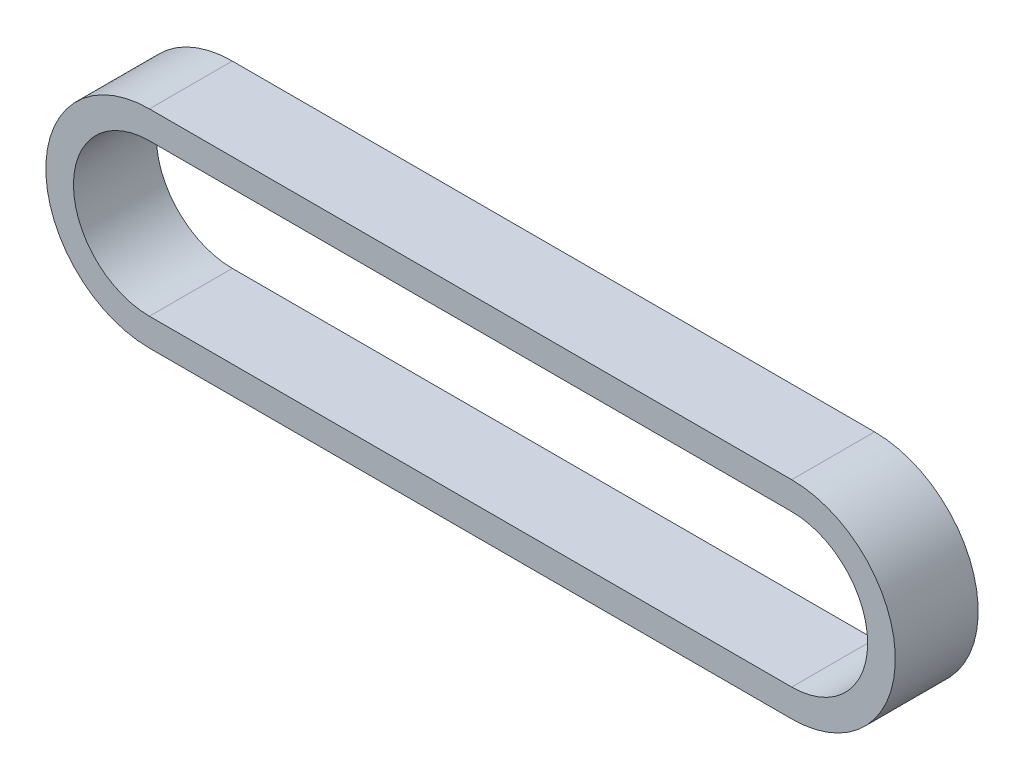
ISO-10303-21;
HEADER;
FILE_DESCRIPTION(('STEP AP214'),'2;1');
FILE_NAME('part.step','',(''),(''),'','','');
FILE_SCHEMA(('AUTOMOTIVE_DESIGN { 1 0 10303 214 1 1 1 1 }'));
ENDSEC;
DATA;
#1=APPLICATION_CONTEXT('core data for automotive mechanical design processes');
#2=APPLICATION_PROTOCOL_DEFINITION('international standard','automotive_design',2000,#1);
#3=PRODUCT_CONTEXT('',#1,'mechanical');
#4=PRODUCT('Part','Part','',(#3));
#5=PRODUCT_RELATED_PRODUCT_CATEGORY('part','',(#4));
#6=PRODUCT_DEFINITION_FORMATION('','',#4);
#7=PRODUCT_DEFINITION_CONTEXT('part definition',#1,'design');
#8=PRODUCT_DEFINITION('design','',#6,#7);
#9=PRODUCT_DEFINITION_SHAPE('','',#8);
#10=(LENGTH_UNIT() NAMED_UNIT(*) SI_UNIT(.MILLI.,.METRE.));
#11=(NAMED_UNIT(*) PLANE_ANGLE_UNIT() SI_UNIT($,.RADIAN.));
#12=(NAMED_UNIT(*) SI_UNIT($,.STERADIAN.) SOLID_ANGLE_UNIT());
#13=UNCERTAINTY_MEASURE_WITH_UNIT(LENGTH_MEASURE(1.E-05),#10,'distance_accuracy_value','');
#14=(GEOMETRIC_REPRESENTATION_CONTEXT(3) GLOBAL_UNCERTAINTY_ASSIGNED_CONTEXT((#13)) GLOBAL_UNIT_ASSIGNED_CONTEXT((#10,
#11,#12)) REPRESENTATION_CONTEXT('',''));
#15=CARTESIAN_POINT('',(0.,0.,0.));
#16=DIRECTION('',(0.,0.,1.));
#17=DIRECTION('',(1.,0.,0.));
#18=AXIS2_PLACEMENT_3D('',#15,#16,#17);
#19=CARTESIAN_POINT('',(0.,0.,6.));
#20=DIRECTION('',(0.,0.,1.));
#21=DIRECTION('',(1.,0.,0.));
#22=AXIS2_PLACEMENT_3D('',#19,#20,#21);
#23=PLANE('',#22);
#24=CARTESIAN_POINT('',(0.,0.,6.));
#25=DIRECTION('',(0.,0.,1.));
#26=DIRECTION('',(1.,0.,0.));
#27=AXIS2_PLACEMENT_3D('',#24,#25,#26);
#28=CIRCLE('',#27,7.5);
#29=CARTESIAN_POINT('',(0.,7.5,6.));
#30=VERTEX_POINT('',#29);
#31=CARTESIAN_POINT('',(0.,-7.5,6.));
#32=VERTEX_POINT('',#31);
#33=EDGE_CURVE('E136',#30,#32,#28,.T.);
#34=ORIENTED_EDGE('',*,*,#33,.T.);
#35=DIRECTION('',(1.,0.,0.));
#36=VECTOR('',#35,1.);
#37=CARTESIAN_POINT('',(0.,-7.5,6.));
#38=LINE('',#37,#36);
#39=CARTESIAN_POINT('',(46.5,-7.5,6.));
#40=VERTEX_POINT('',#39);
#41=EDGE_CURVE('E139',#32,#40,#38,.T.);
#42=ORIENTED_EDGE('',*,*,#41,.T.);
#43=CARTESIAN_POINT('',(46.5,0.,6.));
#44=DIRECTION('',(0.,0.,1.));
#45=DIRECTION('',(1.,0.,0.));
#46=AXIS2_PLACEMENT_3D('',#43,#44,#45);
#47=CIRCLE('',#46,7.5);
#48=CARTESIAN_POINT('',(46.5,7.5,6.));
#49=VERTEX_POINT('',#48);
#50=EDGE_CURVE('E142',#40,#49,#47,.T.);
#51=ORIENTED_EDGE('',*,*,#50,.T.);
#52=DIRECTION('',(-1.,0.,0.));
#53=VECTOR('',#52,1.);
#54=CARTESIAN_POINT('',(0.,7.5,6.));
#55=LINE('',#54,#53);
#56=EDGE_CURVE('E144',#49,#30,#55,.T.);
#57=ORIENTED_EDGE('',*,*,#56,.T.);
#58=EDGE_LOOP('',(#34,#42,#51,#57));
#59=FACE_BOUND('',#58,.T.);
#60=DIRECTION('',(1.,0.,0.));
#61=VECTOR('',#60,1.);
#62=CARTESIAN_POINT('',(0.,-5.5,6.));
#63=LINE('',#62,#61);
#64=CARTESIAN_POINT('',(0.,-5.5,6.));
#65=VERTEX_POINT('',#64);
#66=CARTESIAN_POINT('',(46.5,-5.5,6.));
#67=VERTEX_POINT('',#66);
#68=EDGE_CURVE('E108',#65,#67,#63,.T.);
#69=ORIENTED_EDGE('',*,*,#68,.F.);
#70=CARTESIAN_POINT('',(0.,0.,6.));
#71=DIRECTION('',(0.,0.,1.));
#72=DIRECTION('',(1.,0.,0.));
#73=AXIS2_PLACEMENT_3D('',#70,#71,#72);
#74=CIRCLE('',#73,5.5);
#75=CARTESIAN_POINT('',(0.,5.5,6.));
#76=VERTEX_POINT('',#75);
#77=EDGE_CURVE('E100',#76,#65,#74,.T.);
#78=ORIENTED_EDGE('',*,*,#77,.F.);
#79=DIRECTION('',(-1.,0.,0.));
#80=VECTOR('',#79,1.);
#81=CARTESIAN_POINT('',(0.,5.5,6.));
#82=LINE('',#81,#80);
#83=CARTESIAN_POINT('',(46.5,5.5,6.));
#84=VERTEX_POINT('',#83);
#85=EDGE_CURVE('E122',#84,#76,#82,.T.);
#86=ORIENTED_EDGE('',*,*,#85,.F.);
#87=CARTESIAN_POINT('',(46.5,0.,6.));
#88=DIRECTION('',(0.,0.,1.));
#89=DIRECTION('',(1.,0.,0.));
#90=AXIS2_PLACEMENT_3D('',#87,#88,#89);
#91=CIRCLE('',#90,5.5);
#92=EDGE_CURVE('E120',#67,#84,#91,.T.);
#93=ORIENTED_EDGE('',*,*,#92,.F.);
#94=EDGE_LOOP('',(#69,#78,#86,#93));
#95=FACE_BOUND('',#94,.T.);
#96=ADVANCED_FACE('F35',(#59,#95),#23,.T.);
#97=CARTESIAN_POINT('',(0.,0.,0.));
#98=DIRECTION('',(0.,0.,1.));
#99=DIRECTION('',(1.,0.,0.));
#100=AXIS2_PLACEMENT_3D('',#97,#98,#99);
#101=PLANE('',#100);
#102=CARTESIAN_POINT('',(0.,0.,0.));
#103=DIRECTION('',(0.,0.,1.));
#104=DIRECTION('',(1.,0.,0.));
#105=AXIS2_PLACEMENT_3D('',#102,#103,#104);
#106=CIRCLE('',#105,7.5);
#107=CARTESIAN_POINT('',(0.,7.5,0.));
#108=VERTEX_POINT('',#107);
#109=CARTESIAN_POINT('',(0.,-7.5,0.));
#110=VERTEX_POINT('',#109);
#111=EDGE_CURVE('E116',#108,#110,#106,.T.);
#112=ORIENTED_EDGE('',*,*,#111,.F.);
#113=DIRECTION('',(-1.,0.,0.));
#114=VECTOR('',#113,1.);
#115=CARTESIAN_POINT('',(0.,7.5,0.));
#116=LINE('',#115,#114);
#117=CARTESIAN_POINT('',(46.5,7.5,0.));
#118=VERTEX_POINT('',#117);
#119=EDGE_CURVE('E140',#118,#108,#116,.T.);
#120=ORIENTED_EDGE('',*,*,#119,.F.);
#121=CARTESIAN_POINT('',(46.5,0.,0.));
#122=DIRECTION('',(0.,0.,1.));
#123=DIRECTION('',(1.,0.,0.));
#124=AXIS2_PLACEMENT_3D('',#121,#122,#123);
#125=CIRCLE('',#124,7.5);
#126=CARTESIAN_POINT('',(46.5,-7.5,0.));
#127=VERTEX_POINT('',#126);
#128=EDGE_CURVE('E151',#127,#118,#125,.T.);
#129=ORIENTED_EDGE('',*,*,#128,.F.);
#130=DIRECTION('',(1.,0.,0.));
#131=VECTOR('',#130,1.);
#132=CARTESIAN_POINT('',(0.,-7.5,0.));
#133=LINE('',#132,#131);
#134=EDGE_CURVE('E149',#110,#127,#133,.T.);
#135=ORIENTED_EDGE('',*,*,#134,.F.);
#136=EDGE_LOOP('',(#112,#120,#129,#135));
#137=FACE_BOUND('',#136,.T.);
#138=CARTESIAN_POINT('',(0.,0.,0.));
#139=DIRECTION('',(0.,0.,1.));
#140=DIRECTION('',(1.,0.,0.));
#141=AXIS2_PLACEMENT_3D('',#138,#139,#140);
#142=CIRCLE('',#141,5.5);
#143=CARTESIAN_POINT('',(0.,5.5,0.));
#144=VERTEX_POINT('',#143);
#145=CARTESIAN_POINT('',(0.,-5.5,0.));
#146=VERTEX_POINT('',#145);
#147=EDGE_CURVE('E58',#144,#146,#142,.T.);
#148=ORIENTED_EDGE('',*,*,#147,.T.);
#149=DIRECTION('',(1.,0.,0.));
#150=VECTOR('',#149,1.);
#151=CARTESIAN_POINT('',(0.,-5.5,0.));
#152=LINE('',#151,#150);
#153=CARTESIAN_POINT('',(46.5,-5.5,0.));
#154=VERTEX_POINT('',#153);
#155=EDGE_CURVE('E115',#146,#154,#152,.T.);
#156=ORIENTED_EDGE('',*,*,#155,.T.);
#157=CARTESIAN_POINT('',(46.5,0.,0.));
#158=DIRECTION('',(0.,0.,1.));
#159=DIRECTION('',(1.,0.,0.));
#160=AXIS2_PLACEMENT_3D('',#157,#158,#159);
#161=CIRCLE('',#160,5.5);
#162=CARTESIAN_POINT('',(46.5,5.5,0.));
#163=VERTEX_POINT('',#162);
#164=EDGE_CURVE('E128',#154,#163,#161,.T.);
#165=ORIENTED_EDGE('',*,*,#164,.T.);
#166=DIRECTION('',(-1.,0.,0.));
#167=VECTOR('',#166,1.);
#168=CARTESIAN_POINT('',(0.,5.5,0.));
#169=LINE('',#168,#167);
#170=EDGE_CURVE('E109',#163,#144,#169,.T.);
#171=ORIENTED_EDGE('',*,*,#170,.T.);
#172=EDGE_LOOP('',(#148,#156,#165,#171));
#173=FACE_BOUND('',#172,.T.);
#174=ADVANCED_FACE('F169',(#137,#173),#101,.F.);
#175=CARTESIAN_POINT('',(0.,0.,6.));
#176=DIRECTION('',(0.,0.,-1.));
#177=DIRECTION('',(-1.,0.,0.));
#178=AXIS2_PLACEMENT_3D('',#175,#176,#177);
#179=CYLINDRICAL_SURFACE('',#178,7.5);
#180=ORIENTED_EDGE('',*,*,#111,.T.);
#181=DIRECTION('',(0.,0.,-1.));
#182=VECTOR('',#181,1.);
#183=CARTESIAN_POINT('',(0.,-7.5,6.));
#184=LINE('',#183,#182);
#185=EDGE_CURVE('E11',#32,#110,#184,.T.);
#186=ORIENTED_EDGE('',*,*,#185,.F.);
#187=ORIENTED_EDGE('',*,*,#33,.F.);
#188=DIRECTION('',(0.,0.,-1.));
#189=VECTOR('',#188,1.);
#190=CARTESIAN_POINT('',(0.,7.5,6.));
#191=LINE('',#190,#189);
#192=EDGE_CURVE('E146',#30,#108,#191,.T.);
#193=ORIENTED_EDGE('',*,*,#192,.T.);
#194=EDGE_LOOP('',(#180,#186,#187,#193));
#195=FACE_BOUND('',#194,.T.);
#196=ADVANCED_FACE('F37',(#195),#179,.T.);
#197=CARTESIAN_POINT('',(0.,-7.5,6.));
#198=DIRECTION('',(0.,1.,0.));
#199=DIRECTION('',(0.,0.,1.));
#200=AXIS2_PLACEMENT_3D('',#197,#198,#199);
#201=PLANE('',#200);
#202=ORIENTED_EDGE('',*,*,#134,.T.);
#203=DIRECTION('',(0.,0.,-1.));
#204=VECTOR('',#203,1.);
#205=CARTESIAN_POINT('',(46.5,-7.5,6.));
#206=LINE('',#205,#204);
#207=EDGE_CURVE('E43',#40,#127,#206,.T.);
#208=ORIENTED_EDGE('',*,*,#207,.F.);
#209=ORIENTED_EDGE('',*,*,#41,.F.);
#210=ORIENTED_EDGE('',*,*,#185,.T.);
#211=EDGE_LOOP('',(#202,#208,#209,#210));
#212=FACE_BOUND('',#211,.T.);
#213=ADVANCED_FACE('F179',(#212),#201,.F.);
#214=CARTESIAN_POINT('',(46.5,0.,6.));
#215=DIRECTION('',(0.,0.,-1.));
#216=DIRECTION('',(-1.,0.,0.));
#217=AXIS2_PLACEMENT_3D('',#214,#215,#216);
#218=CYLINDRICAL_SURFACE('',#217,7.5);
#219=ORIENTED_EDGE('',*,*,#128,.T.);
#220=DIRECTION('',(0.,0.,-1.));
#221=VECTOR('',#220,1.);
#222=CARTESIAN_POINT('',(46.5,7.5,6.));
#223=LINE('',#222,#221);
#224=EDGE_CURVE('E156',#49,#118,#223,.T.);
#225=ORIENTED_EDGE('',*,*,#224,.F.);
#226=ORIENTED_EDGE('',*,*,#50,.F.);
#227=ORIENTED_EDGE('',*,*,#207,.T.);
#228=EDGE_LOOP('',(#219,#225,#226,#227));
#229=FACE_BOUND('',#228,.T.);
#230=ADVANCED_FACE('F163',(#229),#218,.T.);
#231=CARTESIAN_POINT('',(0.,7.5,6.));
#232=DIRECTION('',(0.,-1.,0.));
#233=DIRECTION('',(0.,0.,-1.));
#234=AXIS2_PLACEMENT_3D('',#231,#232,#233);
#235=PLANE('',#234);
#236=ORIENTED_EDGE('',*,*,#119,.T.);
#237=ORIENTED_EDGE('',*,*,#192,.F.);
#238=ORIENTED_EDGE('',*,*,#56,.F.);
#239=ORIENTED_EDGE('',*,*,#224,.T.);
#240=EDGE_LOOP('',(#236,#237,#238,#239));
#241=FACE_BOUND('',#240,.T.);
#242=ADVANCED_FACE('F173',(#241),#235,.F.);
#243=CARTESIAN_POINT('',(0.,0.,6.));
#244=DIRECTION('',(0.,0.,-1.));
#245=DIRECTION('',(-1.,0.,0.));
#246=AXIS2_PLACEMENT_3D('',#243,#244,#245);
#247=CYLINDRICAL_SURFACE('',#246,5.5);
#248=ORIENTED_EDGE('',*,*,#147,.F.);
#249=DIRECTION('',(0.,0.,-1.));
#250=VECTOR('',#249,1.);
#251=CARTESIAN_POINT('',(0.,5.5,6.));
#252=LINE('',#251,#250);
#253=EDGE_CURVE('E104',#76,#144,#252,.T.);
#254=ORIENTED_EDGE('',*,*,#253,.F.);
#255=ORIENTED_EDGE('',*,*,#77,.T.);
#256=DIRECTION('',(0.,0.,-1.));
#257=VECTOR('',#256,1.);
#258=CARTESIAN_POINT('',(0.,-5.5,6.));
#259=LINE('',#258,#257);
#260=EDGE_CURVE('E103',#65,#146,#259,.T.);
#261=ORIENTED_EDGE('',*,*,#260,.T.);
#262=EDGE_LOOP('',(#248,#254,#255,#261));
#263=FACE_BOUND('',#262,.T.);
#264=ADVANCED_FACE('F102',(#263),#247,.F.);
#265=CARTESIAN_POINT('',(0.,-5.5,6.));
#266=DIRECTION('',(0.,1.,0.));
#267=DIRECTION('',(0.,0.,1.));
#268=AXIS2_PLACEMENT_3D('',#265,#266,#267);
#269=PLANE('',#268);
#270=ORIENTED_EDGE('',*,*,#155,.F.);
#271=ORIENTED_EDGE('',*,*,#260,.F.);
#272=ORIENTED_EDGE('',*,*,#68,.T.);
#273=DIRECTION('',(0.,0.,-1.));
#274=VECTOR('',#273,1.);
#275=CARTESIAN_POINT('',(46.5,-5.5,6.));
#276=LINE('',#275,#274);
#277=EDGE_CURVE('E117',#67,#154,#276,.T.);
#278=ORIENTED_EDGE('',*,*,#277,.T.);
#279=EDGE_LOOP('',(#270,#271,#272,#278));
#280=FACE_BOUND('',#279,.T.);
#281=ADVANCED_FACE('F112',(#280),#269,.T.);
#282=CARTESIAN_POINT('',(46.5,0.,6.));
#283=DIRECTION('',(0.,0.,-1.));
#284=DIRECTION('',(-1.,0.,0.));
#285=AXIS2_PLACEMENT_3D('',#282,#283,#284);
#286=CYLINDRICAL_SURFACE('',#285,5.5);
#287=ORIENTED_EDGE('',*,*,#164,.F.);
#288=ORIENTED_EDGE('',*,*,#277,.F.);
#289=ORIENTED_EDGE('',*,*,#92,.T.);
#290=DIRECTION('',(0.,0.,-1.));
#291=VECTOR('',#290,1.);
#292=CARTESIAN_POINT('',(46.5,5.5,6.));
#293=LINE('',#292,#291);
#294=EDGE_CURVE('E50',#84,#163,#293,.T.);
#295=ORIENTED_EDGE('',*,*,#294,.T.);
#296=EDGE_LOOP('',(#287,#288,#289,#295));
#297=FACE_BOUND('',#296,.T.);
#298=ADVANCED_FACE('F202',(#297),#286,.F.);
#299=CARTESIAN_POINT('',(0.,5.5,6.));
#300=DIRECTION('',(0.,-1.,0.));
#301=DIRECTION('',(0.,0.,-1.));
#302=AXIS2_PLACEMENT_3D('',#299,#300,#301);
#303=PLANE('',#302);
#304=ORIENTED_EDGE('',*,*,#170,.F.);
#305=ORIENTED_EDGE('',*,*,#294,.F.);
#306=ORIENTED_EDGE('',*,*,#85,.T.);
#307=ORIENTED_EDGE('',*,*,#253,.T.);
#308=EDGE_LOOP('',(#304,#305,#306,#307));
#309=FACE_BOUND('',#308,.T.);
#310=ADVANCED_FACE('F206',(#309),#303,.T.);
#311=CLOSED_SHELL('',(#96,#174,#196,#213,#230,#242,#264,#281,#298,#310));
#312=MANIFOLD_SOLID_BREP('B2',#311);
#313=ADVANCED_BREP_SHAPE_REPRESENTATION('',(#18,#312),#14);
#314=SHAPE_DEFINITION_REPRESENTATION(#9,#313);
ENDSEC;
END-ISO-10303-21;
